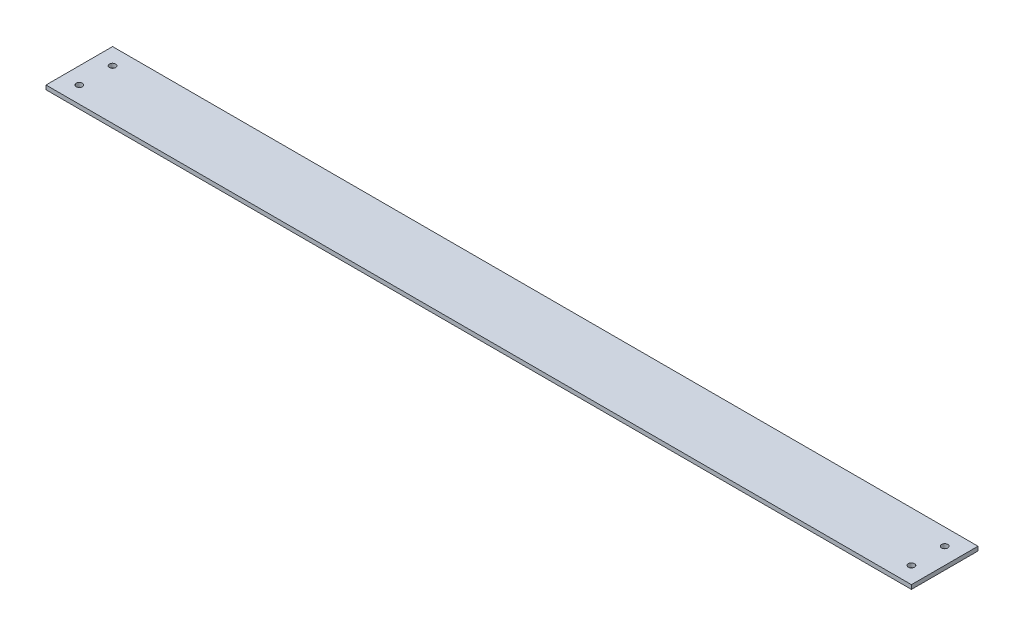
ISO-10303-21;
HEADER;
FILE_DESCRIPTION(('STEP AP214'),'2;1');
FILE_NAME('part.step','',(''),(''),'','','');
FILE_SCHEMA(('AUTOMOTIVE_DESIGN { 1 0 10303 214 1 1 1 1 }'));
ENDSEC;
DATA;
#1=APPLICATION_CONTEXT('core data for automotive mechanical design processes');
#2=APPLICATION_PROTOCOL_DEFINITION('international standard','automotive_design',2000,#1);
#3=PRODUCT_CONTEXT('',#1,'mechanical');
#4=PRODUCT('Part','Part','',(#3));
#5=PRODUCT_RELATED_PRODUCT_CATEGORY('part','',(#4));
#6=PRODUCT_DEFINITION_FORMATION('','',#4);
#7=PRODUCT_DEFINITION_CONTEXT('part definition',#1,'design');
#8=PRODUCT_DEFINITION('design','',#6,#7);
#9=PRODUCT_DEFINITION_SHAPE('','',#8);
#10=(LENGTH_UNIT() NAMED_UNIT(*) SI_UNIT(.MILLI.,.METRE.));
#11=(NAMED_UNIT(*) PLANE_ANGLE_UNIT() SI_UNIT($,.RADIAN.));
#12=(NAMED_UNIT(*) SI_UNIT($,.STERADIAN.) SOLID_ANGLE_UNIT());
#13=UNCERTAINTY_MEASURE_WITH_UNIT(LENGTH_MEASURE(1.E-05),#10,'distance_accuracy_value','');
#14=(GEOMETRIC_REPRESENTATION_CONTEXT(3) GLOBAL_UNCERTAINTY_ASSIGNED_CONTEXT((#13)) GLOBAL_UNIT_ASSIGNED_CONTEXT((#10,
#11,#12)) REPRESENTATION_CONTEXT('',''));
#15=CARTESIAN_POINT('',(0.,0.,0.));
#16=DIRECTION('',(0.,0.,1.));
#17=DIRECTION('',(1.,0.,0.));
#18=AXIS2_PLACEMENT_3D('',#15,#16,#17);
#19=CARTESIAN_POINT('',(0.,3.175,0.));
#20=DIRECTION('',(0.,1.,0.));
#21=DIRECTION('',(0.,0.,1.));
#22=AXIS2_PLACEMENT_3D('',#19,#20,#21);
#23=PLANE('',#22);
#24=CARTESIAN_POINT('',(317.5,3.175,12.7));
#25=DIRECTION('',(0.,1.,0.));
#26=DIRECTION('',(0.,0.,-1.));
#27=AXIS2_PLACEMENT_3D('',#24,#25,#26);
#28=CIRCLE('',#27,2.38125000000001);
#29=CARTESIAN_POINT('',(317.5,3.175,10.31875));
#30=VERTEX_POINT('',#29);
#31=EDGE_CURVE('E125',#30,#30,#28,.T.);
#32=ORIENTED_EDGE('',*,*,#31,.F.);
#33=EDGE_LOOP('',(#32));
#34=FACE_BOUND('',#33,.T.);
#35=CARTESIAN_POINT('',(-317.5,3.175,-12.7));
#36=DIRECTION('',(0.,1.,0.));
#37=DIRECTION('',(0.,0.,1.));
#38=AXIS2_PLACEMENT_3D('',#35,#36,#37);
#39=CIRCLE('',#38,2.38125000000001);
#40=CARTESIAN_POINT('',(-317.5,3.175,-10.31875));
#41=VERTEX_POINT('',#40);
#42=EDGE_CURVE('E104',#41,#41,#39,.T.);
#43=ORIENTED_EDGE('',*,*,#42,.F.);
#44=EDGE_LOOP('',(#43));
#45=FACE_BOUND('',#44,.T.);
#46=DIRECTION('',(0.,0.,-1.));
#47=VECTOR('',#46,1.);
#48=CARTESIAN_POINT('',(330.2,3.175,-25.4));
#49=LINE('',#48,#47);
#50=CARTESIAN_POINT('',(330.2,3.175,25.4));
#51=VERTEX_POINT('',#50);
#52=CARTESIAN_POINT('',(330.2,3.175,-25.4));
#53=VERTEX_POINT('',#52);
#54=EDGE_CURVE('E89',#51,#53,#49,.T.);
#55=ORIENTED_EDGE('',*,*,#54,.T.);
#56=DIRECTION('',(-1.,0.,0.));
#57=VECTOR('',#56,1.);
#58=CARTESIAN_POINT('',(-330.2,3.175,-25.4));
#59=LINE('',#58,#57);
#60=CARTESIAN_POINT('',(-330.2,3.175,-25.4));
#61=VERTEX_POINT('',#60);
#62=EDGE_CURVE('E84',#53,#61,#59,.T.);
#63=ORIENTED_EDGE('',*,*,#62,.T.);
#64=DIRECTION('',(0.,0.,1.));
#65=VECTOR('',#64,1.);
#66=CARTESIAN_POINT('',(-330.2,3.175,-25.4));
#67=LINE('',#66,#65);
#68=CARTESIAN_POINT('',(-330.2,3.175,25.4));
#69=VERTEX_POINT('',#68);
#70=EDGE_CURVE('E87',#61,#69,#67,.T.);
#71=ORIENTED_EDGE('',*,*,#70,.T.);
#72=DIRECTION('',(1.,0.,0.));
#73=VECTOR('',#72,1.);
#74=CARTESIAN_POINT('',(-330.2,3.175,25.4));
#75=LINE('',#74,#73);
#76=EDGE_CURVE('E54',#69,#51,#75,.T.);
#77=ORIENTED_EDGE('',*,*,#76,.T.);
#78=EDGE_LOOP('',(#55,#63,#71,#77));
#79=FACE_BOUND('',#78,.T.);
#80=CARTESIAN_POINT('',(-317.5,3.175,12.7));
#81=DIRECTION('',(0.,1.,0.));
#82=DIRECTION('',(0.,0.,1.));
#83=AXIS2_PLACEMENT_3D('',#80,#81,#82);
#84=CIRCLE('',#83,2.38125000000001);
#85=CARTESIAN_POINT('',(-317.5,3.175,15.08125));
#86=VERTEX_POINT('',#85);
#87=EDGE_CURVE('E119',#86,#86,#84,.T.);
#88=ORIENTED_EDGE('',*,*,#87,.F.);
#89=EDGE_LOOP('',(#88));
#90=FACE_BOUND('',#89,.T.);
#91=CARTESIAN_POINT('',(317.5,3.175,-12.7));
#92=DIRECTION('',(0.,1.,0.));
#93=DIRECTION('',(0.,0.,-1.));
#94=AXIS2_PLACEMENT_3D('',#91,#92,#93);
#95=CIRCLE('',#94,2.38125000000001);
#96=CARTESIAN_POINT('',(317.5,3.175,-15.08125));
#97=VERTEX_POINT('',#96);
#98=EDGE_CURVE('E131',#97,#97,#95,.T.);
#99=ORIENTED_EDGE('',*,*,#98,.F.);
#100=EDGE_LOOP('',(#99));
#101=FACE_BOUND('',#100,.T.);
#102=ADVANCED_FACE('F37',(#34,#45,#79,#90,#101),#23,.T.);
#103=CARTESIAN_POINT('',(0.,0.,0.));
#104=DIRECTION('',(0.,1.,0.));
#105=DIRECTION('',(0.,0.,1.));
#106=AXIS2_PLACEMENT_3D('',#103,#104,#105);
#107=PLANE('',#106);
#108=DIRECTION('',(0.,0.,-1.));
#109=VECTOR('',#108,1.);
#110=CARTESIAN_POINT('',(330.2,0.,-25.4));
#111=LINE('',#110,#109);
#112=CARTESIAN_POINT('',(330.2,0.,25.4));
#113=VERTEX_POINT('',#112);
#114=CARTESIAN_POINT('',(330.2,0.,-25.4));
#115=VERTEX_POINT('',#114);
#116=EDGE_CURVE('E101',#113,#115,#111,.T.);
#117=ORIENTED_EDGE('',*,*,#116,.F.);
#118=DIRECTION('',(1.,0.,0.));
#119=VECTOR('',#118,1.);
#120=CARTESIAN_POINT('',(-330.2,0.,25.4));
#121=LINE('',#120,#119);
#122=CARTESIAN_POINT('',(-330.2,0.,25.4));
#123=VERTEX_POINT('',#122);
#124=EDGE_CURVE('E77',#123,#113,#121,.T.);
#125=ORIENTED_EDGE('',*,*,#124,.F.);
#126=DIRECTION('',(0.,0.,1.));
#127=VECTOR('',#126,1.);
#128=CARTESIAN_POINT('',(-330.2,0.,-25.4));
#129=LINE('',#128,#127);
#130=CARTESIAN_POINT('',(-330.2,0.,-25.4));
#131=VERTEX_POINT('',#130);
#132=EDGE_CURVE('E71',#131,#123,#129,.T.);
#133=ORIENTED_EDGE('',*,*,#132,.F.);
#134=DIRECTION('',(-1.,0.,0.));
#135=VECTOR('',#134,1.);
#136=CARTESIAN_POINT('',(-330.2,0.,-25.4));
#137=LINE('',#136,#135);
#138=EDGE_CURVE('E93',#115,#131,#137,.T.);
#139=ORIENTED_EDGE('',*,*,#138,.F.);
#140=EDGE_LOOP('',(#117,#125,#133,#139));
#141=FACE_BOUND('',#140,.T.);
#142=CARTESIAN_POINT('',(-317.5,0.,-12.7));
#143=DIRECTION('',(0.,1.,0.));
#144=DIRECTION('',(0.,0.,1.));
#145=AXIS2_PLACEMENT_3D('',#142,#143,#144);
#146=CIRCLE('',#145,2.38125000000001);
#147=CARTESIAN_POINT('',(-317.5,0.,-10.31875));
#148=VERTEX_POINT('',#147);
#149=EDGE_CURVE('E116',#148,#148,#146,.T.);
#150=ORIENTED_EDGE('',*,*,#149,.T.);
#151=EDGE_LOOP('',(#150));
#152=FACE_BOUND('',#151,.T.);
#153=CARTESIAN_POINT('',(-317.5,0.,12.7));
#154=DIRECTION('',(0.,1.,0.));
#155=DIRECTION('',(0.,0.,1.));
#156=AXIS2_PLACEMENT_3D('',#153,#154,#155);
#157=CIRCLE('',#156,2.38125000000001);
#158=CARTESIAN_POINT('',(-317.5,0.,15.08125));
#159=VERTEX_POINT('',#158);
#160=EDGE_CURVE('E122',#159,#159,#157,.T.);
#161=ORIENTED_EDGE('',*,*,#160,.T.);
#162=EDGE_LOOP('',(#161));
#163=FACE_BOUND('',#162,.T.);
#164=CARTESIAN_POINT('',(317.5,0.,12.7));
#165=DIRECTION('',(0.,1.,0.));
#166=DIRECTION('',(0.,0.,-1.));
#167=AXIS2_PLACEMENT_3D('',#164,#165,#166);
#168=CIRCLE('',#167,2.38125000000001);
#169=CARTESIAN_POINT('',(317.5,0.,10.31875));
#170=VERTEX_POINT('',#169);
#171=EDGE_CURVE('E128',#170,#170,#168,.T.);
#172=ORIENTED_EDGE('',*,*,#171,.T.);
#173=EDGE_LOOP('',(#172));
#174=FACE_BOUND('',#173,.T.);
#175=CARTESIAN_POINT('',(317.5,0.,-12.7));
#176=DIRECTION('',(0.,1.,0.));
#177=DIRECTION('',(0.,0.,-1.));
#178=AXIS2_PLACEMENT_3D('',#175,#176,#177);
#179=CIRCLE('',#178,2.38125000000001);
#180=CARTESIAN_POINT('',(317.5,0.,-15.08125));
#181=VERTEX_POINT('',#180);
#182=EDGE_CURVE('E134',#181,#181,#179,.T.);
#183=ORIENTED_EDGE('',*,*,#182,.T.);
#184=EDGE_LOOP('',(#183));
#185=FACE_BOUND('',#184,.T.);
#186=ADVANCED_FACE('F112',(#141,#152,#163,#174,#185),#107,.F.);
#187=CARTESIAN_POINT('',(330.2,3.175,-25.4));
#188=DIRECTION('',(-1.,0.,0.));
#189=DIRECTION('',(0.,0.,1.));
#190=AXIS2_PLACEMENT_3D('',#187,#188,#189);
#191=PLANE('',#190);
#192=ORIENTED_EDGE('',*,*,#116,.T.);
#193=DIRECTION('',(0.,-1.,0.));
#194=VECTOR('',#193,1.);
#195=CARTESIAN_POINT('',(330.2,3.175,-25.4));
#196=LINE('',#195,#194);
#197=EDGE_CURVE('E11',#53,#115,#196,.T.);
#198=ORIENTED_EDGE('',*,*,#197,.F.);
#199=ORIENTED_EDGE('',*,*,#54,.F.);
#200=DIRECTION('',(0.,-1.,0.));
#201=VECTOR('',#200,1.);
#202=CARTESIAN_POINT('',(330.2,3.175,25.4));
#203=LINE('',#202,#201);
#204=EDGE_CURVE('E97',#51,#113,#203,.T.);
#205=ORIENTED_EDGE('',*,*,#204,.T.);
#206=EDGE_LOOP('',(#192,#198,#199,#205));
#207=FACE_BOUND('',#206,.T.);
#208=ADVANCED_FACE('F39',(#207),#191,.F.);
#209=CARTESIAN_POINT('',(-330.2,3.175,-25.4));
#210=DIRECTION('',(0.,0.,1.));
#211=DIRECTION('',(1.,0.,0.));
#212=AXIS2_PLACEMENT_3D('',#209,#210,#211);
#213=PLANE('',#212);
#214=ORIENTED_EDGE('',*,*,#138,.T.);
#215=DIRECTION('',(0.,-1.,0.));
#216=VECTOR('',#215,1.);
#217=CARTESIAN_POINT('',(-330.2,3.175,-25.4));
#218=LINE('',#217,#216);
#219=EDGE_CURVE('E46',#61,#131,#218,.T.);
#220=ORIENTED_EDGE('',*,*,#219,.F.);
#221=ORIENTED_EDGE('',*,*,#62,.F.);
#222=ORIENTED_EDGE('',*,*,#197,.T.);
#223=EDGE_LOOP('',(#214,#220,#221,#222));
#224=FACE_BOUND('',#223,.T.);
#225=ADVANCED_FACE('F92',(#224),#213,.F.);
#226=CARTESIAN_POINT('',(-330.2,3.175,-25.4));
#227=DIRECTION('',(1.,0.,0.));
#228=DIRECTION('',(0.,0.,-1.));
#229=AXIS2_PLACEMENT_3D('',#226,#227,#228);
#230=PLANE('',#229);
#231=ORIENTED_EDGE('',*,*,#132,.T.);
#232=DIRECTION('',(0.,-1.,0.));
#233=VECTOR('',#232,1.);
#234=CARTESIAN_POINT('',(-330.2,3.175,25.4));
#235=LINE('',#234,#233);
#236=EDGE_CURVE('E94',#69,#123,#235,.T.);
#237=ORIENTED_EDGE('',*,*,#236,.F.);
#238=ORIENTED_EDGE('',*,*,#70,.F.);
#239=ORIENTED_EDGE('',*,*,#219,.T.);
#240=EDGE_LOOP('',(#231,#237,#238,#239));
#241=FACE_BOUND('',#240,.T.);
#242=ADVANCED_FACE('F95',(#241),#230,.F.);
#243=CARTESIAN_POINT('',(-330.2,3.175,25.4));
#244=DIRECTION('',(0.,0.,-1.));
#245=DIRECTION('',(-1.,0.,0.));
#246=AXIS2_PLACEMENT_3D('',#243,#244,#245);
#247=PLANE('',#246);
#248=ORIENTED_EDGE('',*,*,#124,.T.);
#249=ORIENTED_EDGE('',*,*,#204,.F.);
#250=ORIENTED_EDGE('',*,*,#76,.F.);
#251=ORIENTED_EDGE('',*,*,#236,.T.);
#252=EDGE_LOOP('',(#248,#249,#250,#251));
#253=FACE_BOUND('',#252,.T.);
#254=ADVANCED_FACE('F109',(#253),#247,.F.);
#255=CARTESIAN_POINT('',(-317.5,3.175,-12.7));
#256=DIRECTION('',(0.,-1.,0.));
#257=DIRECTION('',(0.,0.,-1.));
#258=AXIS2_PLACEMENT_3D('',#255,#256,#257);
#259=CYLINDRICAL_SURFACE('',#258,2.38125000000001);
#260=ORIENTED_EDGE('',*,*,#42,.T.);
#261=EDGE_LOOP('',(#260));
#262=FACE_BOUND('',#261,.T.);
#263=ORIENTED_EDGE('',*,*,#149,.F.);
#264=EDGE_LOOP('',(#263));
#265=FACE_BOUND('',#264,.T.);
#266=ADVANCED_FACE('F153',(#262,#265),#259,.F.);
#267=CARTESIAN_POINT('',(-317.5,3.175,12.7));
#268=DIRECTION('',(0.,-1.,0.));
#269=DIRECTION('',(0.,0.,-1.));
#270=AXIS2_PLACEMENT_3D('',#267,#268,#269);
#271=CYLINDRICAL_SURFACE('',#270,2.38125000000001);
#272=ORIENTED_EDGE('',*,*,#87,.T.);
#273=EDGE_LOOP('',(#272));
#274=FACE_BOUND('',#273,.T.);
#275=ORIENTED_EDGE('',*,*,#160,.F.);
#276=EDGE_LOOP('',(#275));
#277=FACE_BOUND('',#276,.T.);
#278=ADVANCED_FACE('F207',(#274,#277),#271,.F.);
#279=CARTESIAN_POINT('',(317.5,3.175,12.7));
#280=DIRECTION('',(0.,-1.,0.));
#281=DIRECTION('',(0.,0.,-1.));
#282=AXIS2_PLACEMENT_3D('',#279,#280,#281);
#283=CYLINDRICAL_SURFACE('',#282,2.38125000000001);
#284=ORIENTED_EDGE('',*,*,#31,.T.);
#285=EDGE_LOOP('',(#284));
#286=FACE_BOUND('',#285,.T.);
#287=ORIENTED_EDGE('',*,*,#171,.F.);
#288=EDGE_LOOP('',(#287));
#289=FACE_BOUND('',#288,.T.);
#290=ADVANCED_FACE('F216',(#286,#289),#283,.F.);
#291=CARTESIAN_POINT('',(317.5,3.175,-12.7));
#292=DIRECTION('',(0.,-1.,0.));
#293=DIRECTION('',(0.,0.,-1.));
#294=AXIS2_PLACEMENT_3D('',#291,#292,#293);
#295=CYLINDRICAL_SURFACE('',#294,2.38125000000001);
#296=ORIENTED_EDGE('',*,*,#98,.T.);
#297=EDGE_LOOP('',(#296));
#298=FACE_BOUND('',#297,.T.);
#299=ORIENTED_EDGE('',*,*,#182,.F.);
#300=EDGE_LOOP('',(#299));
#301=FACE_BOUND('',#300,.T.);
#302=ADVANCED_FACE('F140',(#298,#301),#295,.F.);
#303=CLOSED_SHELL('',(#102,#186,#208,#225,#242,#254,#266,#278,#290,#302));
#304=MANIFOLD_SOLID_BREP('B2',#303);
#305=ADVANCED_BREP_SHAPE_REPRESENTATION('',(#18,#304),#14);
#306=SHAPE_DEFINITION_REPRESENTATION(#9,#305);
ENDSEC;
END-ISO-10303-21;
